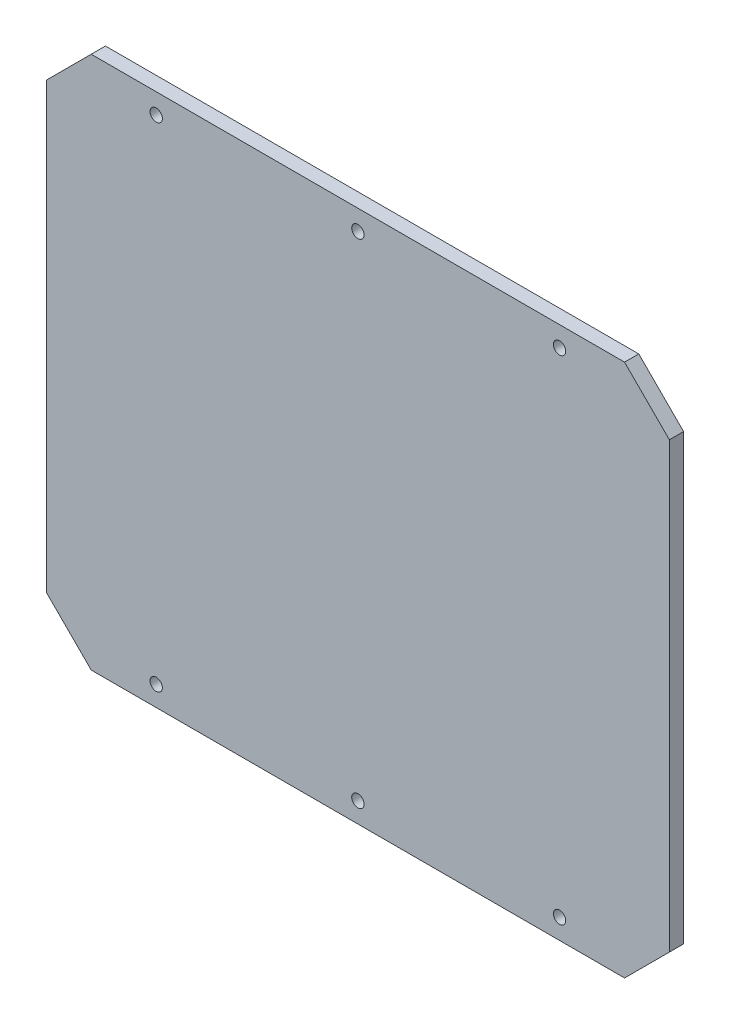
ISO-10303-21;
HEADER;
FILE_DESCRIPTION(('STEP AP214'),'2;1');
FILE_NAME('part.step','',(''),(''),'','','');
FILE_SCHEMA(('AUTOMOTIVE_DESIGN { 1 0 10303 214 1 1 1 1 }'));
ENDSEC;
DATA;
#1=APPLICATION_CONTEXT('core data for automotive mechanical design processes');
#2=APPLICATION_PROTOCOL_DEFINITION('international standard','automotive_design',2000,#1);
#3=PRODUCT_CONTEXT('',#1,'mechanical');
#4=PRODUCT('Part','Part','',(#3));
#5=PRODUCT_RELATED_PRODUCT_CATEGORY('part','',(#4));
#6=PRODUCT_DEFINITION_FORMATION('','',#4);
#7=PRODUCT_DEFINITION_CONTEXT('part definition',#1,'design');
#8=PRODUCT_DEFINITION('design','',#6,#7);
#9=PRODUCT_DEFINITION_SHAPE('','',#8);
#10=(LENGTH_UNIT() NAMED_UNIT(*) SI_UNIT(.MILLI.,.METRE.));
#11=(NAMED_UNIT(*) PLANE_ANGLE_UNIT() SI_UNIT($,.RADIAN.));
#12=(NAMED_UNIT(*) SI_UNIT($,.STERADIAN.) SOLID_ANGLE_UNIT());
#13=UNCERTAINTY_MEASURE_WITH_UNIT(LENGTH_MEASURE(1.E-05),#10,'distance_accuracy_value','');
#14=(GEOMETRIC_REPRESENTATION_CONTEXT(3) GLOBAL_UNCERTAINTY_ASSIGNED_CONTEXT((#13)) GLOBAL_UNIT_ASSIGNED_CONTEXT((#10,
#11,#12)) REPRESENTATION_CONTEXT('',''));
#15=CARTESIAN_POINT('',(0.,0.,0.));
#16=DIRECTION('',(0.,0.,1.));
#17=DIRECTION('',(1.,0.,0.));
#18=AXIS2_PLACEMENT_3D('',#15,#16,#17);
#19=CARTESIAN_POINT('',(-139.,-119.,6.35));
#20=DIRECTION('',(1.,0.,0.));
#21=DIRECTION('',(0.,0.,-1.));
#22=AXIS2_PLACEMENT_3D('',#19,#20,#21);
#23=PLANE('',#22);
#24=DIRECTION('',(0.,-1.,0.));
#25=VECTOR('',#24,1.);
#26=CARTESIAN_POINT('',(-139.,-119.,6.35));
#27=LINE('',#26,#25);
#28=CARTESIAN_POINT('',(-139.,98.9999999999999,6.35));
#29=VERTEX_POINT('',#28);
#30=CARTESIAN_POINT('',(-139.,-98.9999999999999,6.35));
#31=VERTEX_POINT('',#30);
#32=EDGE_CURVE('E130',#29,#31,#27,.T.);
#33=ORIENTED_EDGE('',*,*,#32,.F.);
#34=DIRECTION('',(0.,0.,-1.));
#35=VECTOR('',#34,1.);
#36=CARTESIAN_POINT('',(-139.,99.,6.35));
#37=LINE('',#36,#35);
#38=CARTESIAN_POINT('',(-139.,98.9999999999999,0.));
#39=VERTEX_POINT('',#38);
#40=EDGE_CURVE('E11',#29,#39,#37,.T.);
#41=ORIENTED_EDGE('',*,*,#40,.T.);
#42=DIRECTION('',(0.,-1.,0.));
#43=VECTOR('',#42,1.);
#44=CARTESIAN_POINT('',(-139.,-119.,0.));
#45=LINE('',#44,#43);
#46=CARTESIAN_POINT('',(-139.,-98.9999999999999,0.));
#47=VERTEX_POINT('',#46);
#48=EDGE_CURVE('E132',#39,#47,#45,.T.);
#49=ORIENTED_EDGE('',*,*,#48,.T.);
#50=DIRECTION('',(0.,0.,1.));
#51=VECTOR('',#50,1.);
#52=CARTESIAN_POINT('',(-139.,-98.9999999999999,6.35));
#53=LINE('',#52,#51);
#54=EDGE_CURVE('E42',#47,#31,#53,.T.);
#55=ORIENTED_EDGE('',*,*,#54,.T.);
#56=EDGE_LOOP('',(#33,#41,#49,#55));
#57=FACE_BOUND('',#56,.T.);
#58=ADVANCED_FACE('F33',(#57),#23,.F.);
#59=CARTESIAN_POINT('',(139.,-119.,6.35));
#60=DIRECTION('',(0.,1.,0.));
#61=DIRECTION('',(-1.,0.,0.));
#62=AXIS2_PLACEMENT_3D('',#59,#60,#61);
#63=PLANE('',#62);
#64=DIRECTION('',(1.,0.,0.));
#65=VECTOR('',#64,1.);
#66=CARTESIAN_POINT('',(139.,-119.,0.));
#67=LINE('',#66,#65);
#68=CARTESIAN_POINT('',(-119.,-119.,0.));
#69=VERTEX_POINT('',#68);
#70=CARTESIAN_POINT('',(119.,-119.,0.));
#71=VERTEX_POINT('',#70);
#72=EDGE_CURVE('E128',#69,#71,#67,.T.);
#73=ORIENTED_EDGE('',*,*,#72,.T.);
#74=DIRECTION('',(0.,0.,1.));
#75=VECTOR('',#74,1.);
#76=CARTESIAN_POINT('',(119.,-119.,6.35));
#77=LINE('',#76,#75);
#78=CARTESIAN_POINT('',(119.,-119.,6.35));
#79=VERTEX_POINT('',#78);
#80=EDGE_CURVE('E107',#71,#79,#77,.T.);
#81=ORIENTED_EDGE('',*,*,#80,.T.);
#82=DIRECTION('',(1.,0.,0.));
#83=VECTOR('',#82,1.);
#84=CARTESIAN_POINT('',(139.,-119.,6.35));
#85=LINE('',#84,#83);
#86=CARTESIAN_POINT('',(-119.,-119.,6.35));
#87=VERTEX_POINT('',#86);
#88=EDGE_CURVE('E195',#87,#79,#85,.T.);
#89=ORIENTED_EDGE('',*,*,#88,.F.);
#90=DIRECTION('',(0.,0.,-1.));
#91=VECTOR('',#90,1.);
#92=CARTESIAN_POINT('',(-119.,-119.,6.35));
#93=LINE('',#92,#91);
#94=EDGE_CURVE('E112',#87,#69,#93,.T.);
#95=ORIENTED_EDGE('',*,*,#94,.T.);
#96=EDGE_LOOP('',(#73,#81,#89,#95));
#97=FACE_BOUND('',#96,.T.);
#98=ADVANCED_FACE('F211',(#97),#63,.F.);
#99=CARTESIAN_POINT('',(139.,-119.,6.35));
#100=DIRECTION('',(-1.,0.,0.));
#101=DIRECTION('',(0.,0.,1.));
#102=AXIS2_PLACEMENT_3D('',#99,#100,#101);
#103=PLANE('',#102);
#104=DIRECTION('',(0.,1.,0.));
#105=VECTOR('',#104,1.);
#106=CARTESIAN_POINT('',(139.,-119.,6.35));
#107=LINE('',#106,#105);
#108=CARTESIAN_POINT('',(139.,-99.0000000000001,6.35));
#109=VERTEX_POINT('',#108);
#110=CARTESIAN_POINT('',(139.,98.9999999999999,6.35));
#111=VERTEX_POINT('',#110);
#112=EDGE_CURVE('E121',#109,#111,#107,.T.);
#113=ORIENTED_EDGE('',*,*,#112,.F.);
#114=DIRECTION('',(0.,0.,-1.));
#115=VECTOR('',#114,1.);
#116=CARTESIAN_POINT('',(139.,-99.,6.35));
#117=LINE('',#116,#115);
#118=CARTESIAN_POINT('',(139.,-99.,0.));
#119=VERTEX_POINT('',#118);
#120=EDGE_CURVE('E106',#109,#119,#117,.T.);
#121=ORIENTED_EDGE('',*,*,#120,.T.);
#122=DIRECTION('',(0.,1.,0.));
#123=VECTOR('',#122,1.);
#124=CARTESIAN_POINT('',(139.,-119.,0.));
#125=LINE('',#124,#123);
#126=CARTESIAN_POINT('',(139.,98.9999999999999,0.));
#127=VERTEX_POINT('',#126);
#128=EDGE_CURVE('E119',#119,#127,#125,.T.);
#129=ORIENTED_EDGE('',*,*,#128,.T.);
#130=DIRECTION('',(0.,0.,1.));
#131=VECTOR('',#130,1.);
#132=CARTESIAN_POINT('',(139.,98.9999999999999,6.35));
#133=LINE('',#132,#131);
#134=EDGE_CURVE('E123',#127,#111,#133,.T.);
#135=ORIENTED_EDGE('',*,*,#134,.T.);
#136=EDGE_LOOP('',(#113,#121,#129,#135));
#137=FACE_BOUND('',#136,.T.);
#138=ADVANCED_FACE('F118',(#137),#103,.F.);
#139=CARTESIAN_POINT('',(139.,119.,6.35));
#140=DIRECTION('',(0.,-1.,0.));
#141=DIRECTION('',(1.,0.,0.));
#142=AXIS2_PLACEMENT_3D('',#139,#140,#141);
#143=PLANE('',#142);
#144=DIRECTION('',(-1.,0.,0.));
#145=VECTOR('',#144,1.);
#146=CARTESIAN_POINT('',(139.,119.,6.35));
#147=LINE('',#146,#145);
#148=CARTESIAN_POINT('',(119.,119.,6.35));
#149=VERTEX_POINT('',#148);
#150=CARTESIAN_POINT('',(-119.,119.,6.35));
#151=VERTEX_POINT('',#150);
#152=EDGE_CURVE('E136',#149,#151,#147,.T.);
#153=ORIENTED_EDGE('',*,*,#152,.F.);
#154=DIRECTION('',(0.,0.,-1.));
#155=VECTOR('',#154,1.);
#156=CARTESIAN_POINT('',(119.,119.,6.35));
#157=LINE('',#156,#155);
#158=CARTESIAN_POINT('',(119.,119.,0.));
#159=VERTEX_POINT('',#158);
#160=EDGE_CURVE('E153',#149,#159,#157,.T.);
#161=ORIENTED_EDGE('',*,*,#160,.T.);
#162=DIRECTION('',(-1.,0.,0.));
#163=VECTOR('',#162,1.);
#164=CARTESIAN_POINT('',(139.,119.,0.));
#165=LINE('',#164,#163);
#166=CARTESIAN_POINT('',(-119.,119.,0.));
#167=VERTEX_POINT('',#166);
#168=EDGE_CURVE('E127',#159,#167,#165,.T.);
#169=ORIENTED_EDGE('',*,*,#168,.T.);
#170=DIRECTION('',(0.,0.,1.));
#171=VECTOR('',#170,1.);
#172=CARTESIAN_POINT('',(-119.,119.,6.35));
#173=LINE('',#172,#171);
#174=EDGE_CURVE('E50',#167,#151,#173,.T.);
#175=ORIENTED_EDGE('',*,*,#174,.T.);
#176=EDGE_LOOP('',(#153,#161,#169,#175));
#177=FACE_BOUND('',#176,.T.);
#178=ADVANCED_FACE('F218',(#177),#143,.F.);
#179=CARTESIAN_POINT('',(0.,0.,6.35));
#180=DIRECTION('',(0.,0.,1.));
#181=DIRECTION('',(1.,0.,0.));
#182=AXIS2_PLACEMENT_3D('',#179,#180,#181);
#183=PLANE('',#182);
#184=CARTESIAN_POINT('',(-90.,-110.,6.35));
#185=DIRECTION('',(0.,0.,1.));
#186=DIRECTION('',(-1.,0.,0.));
#187=AXIS2_PLACEMENT_3D('',#184,#185,#186);
#188=CIRCLE('',#187,2.75000000000001);
#189=CARTESIAN_POINT('',(-87.25,-110.,6.35000000000001));
#190=VERTEX_POINT('',#189);
#191=EDGE_CURVE('E184',#190,#190,#188,.T.);
#192=ORIENTED_EDGE('',*,*,#191,.F.);
#193=EDGE_LOOP('',(#192));
#194=FACE_BOUND('',#193,.T.);
#195=CARTESIAN_POINT('',(0.,-110.,6.35));
#196=DIRECTION('',(0.,0.,1.));
#197=DIRECTION('',(-1.,0.,0.));
#198=AXIS2_PLACEMENT_3D('',#195,#196,#197);
#199=CIRCLE('',#198,2.75);
#200=CARTESIAN_POINT('',(2.75000000000004,-110.,6.35000000000001));
#201=VERTEX_POINT('',#200);
#202=EDGE_CURVE('E174',#201,#201,#199,.T.);
#203=ORIENTED_EDGE('',*,*,#202,.F.);
#204=EDGE_LOOP('',(#203));
#205=FACE_BOUND('',#204,.T.);
#206=CARTESIAN_POINT('',(90.0000000000001,-110.,6.35));
#207=DIRECTION('',(0.,0.,1.));
#208=DIRECTION('',(1.,0.,0.));
#209=AXIS2_PLACEMENT_3D('',#206,#207,#208);
#210=CIRCLE('',#209,2.75000000000001);
#211=CARTESIAN_POINT('',(92.7500000000001,-110.,6.35000000000001));
#212=VERTEX_POINT('',#211);
#213=EDGE_CURVE('E171',#212,#212,#210,.T.);
#214=ORIENTED_EDGE('',*,*,#213,.F.);
#215=EDGE_LOOP('',(#214));
#216=FACE_BOUND('',#215,.T.);
#217=CARTESIAN_POINT('',(90.,110.,6.35));
#218=DIRECTION('',(0.,0.,1.));
#219=DIRECTION('',(-1.,0.,0.));
#220=AXIS2_PLACEMENT_3D('',#217,#218,#219);
#221=CIRCLE('',#220,2.75000000000001);
#222=CARTESIAN_POINT('',(92.75,110.,6.35000000000001));
#223=VERTEX_POINT('',#222);
#224=EDGE_CURVE('E168',#223,#223,#221,.T.);
#225=ORIENTED_EDGE('',*,*,#224,.F.);
#226=EDGE_LOOP('',(#225));
#227=FACE_BOUND('',#226,.T.);
#228=CARTESIAN_POINT('',(0.,110.,6.35));
#229=DIRECTION('',(0.,0.,1.));
#230=DIRECTION('',(1.,0.,0.));
#231=AXIS2_PLACEMENT_3D('',#228,#229,#230);
#232=CIRCLE('',#231,2.75);
#233=CARTESIAN_POINT('',(2.75000000000001,110.,6.35000000000001));
#234=VERTEX_POINT('',#233);
#235=EDGE_CURVE('E164',#234,#234,#232,.T.);
#236=ORIENTED_EDGE('',*,*,#235,.F.);
#237=EDGE_LOOP('',(#236));
#238=FACE_BOUND('',#237,.T.);
#239=CARTESIAN_POINT('',(-90.,110.,6.35));
#240=DIRECTION('',(0.,0.,1.));
#241=DIRECTION('',(1.,0.,0.));
#242=AXIS2_PLACEMENT_3D('',#239,#240,#241);
#243=CIRCLE('',#242,2.75000000000001);
#244=CARTESIAN_POINT('',(-87.25,110.,6.35000000000001));
#245=VERTEX_POINT('',#244);
#246=EDGE_CURVE('E160',#245,#245,#243,.T.);
#247=ORIENTED_EDGE('',*,*,#246,.F.);
#248=EDGE_LOOP('',(#247));
#249=FACE_BOUND('',#248,.T.);
#250=ORIENTED_EDGE('',*,*,#88,.T.);
#251=DIRECTION('',(-0.707106781186549,-0.707106781186547,0.));
#252=VECTOR('',#251,1.);
#253=CARTESIAN_POINT('',(119.,-119.,6.35));
#254=LINE('',#253,#252);
#255=EDGE_CURVE('E150',#79,#109,#254,.F.);
#256=ORIENTED_EDGE('',*,*,#255,.T.);
#257=ORIENTED_EDGE('',*,*,#112,.T.);
#258=DIRECTION('',(0.707106781186545,-0.70710678118655,0.));
#259=VECTOR('',#258,1.);
#260=CARTESIAN_POINT('',(119.000000000001,119.,6.35));
#261=LINE('',#260,#259);
#262=EDGE_CURVE('E57',#111,#149,#261,.F.);
#263=ORIENTED_EDGE('',*,*,#262,.T.);
#264=ORIENTED_EDGE('',*,*,#152,.T.);
#265=DIRECTION('',(0.707106781186548,0.707106781186547,0.));
#266=VECTOR('',#265,1.);
#267=CARTESIAN_POINT('',(-119.,119.,6.35));
#268=LINE('',#267,#266);
#269=EDGE_CURVE('E147',#151,#29,#268,.F.);
#270=ORIENTED_EDGE('',*,*,#269,.T.);
#271=ORIENTED_EDGE('',*,*,#32,.T.);
#272=DIRECTION('',(-0.707106781186546,0.70710678118655,0.));
#273=VECTOR('',#272,1.);
#274=CARTESIAN_POINT('',(-119.,-119.,6.35));
#275=LINE('',#274,#273);
#276=EDGE_CURVE('E145',#31,#87,#275,.F.);
#277=ORIENTED_EDGE('',*,*,#276,.T.);
#278=EDGE_LOOP('',(#250,#256,#257,#263,#264,#270,#271,#277));
#279=FACE_BOUND('',#278,.T.);
#280=ADVANCED_FACE('F209',(#194,#205,#216,#227,#238,#249,#279),#183,.T.);
#281=CARTESIAN_POINT('',(0.,0.,0.));
#282=DIRECTION('',(0.,0.,1.));
#283=DIRECTION('',(1.,0.,0.));
#284=AXIS2_PLACEMENT_3D('',#281,#282,#283);
#285=PLANE('',#284);
#286=CARTESIAN_POINT('',(-90.,-110.,0.));
#287=DIRECTION('',(0.,0.,1.));
#288=DIRECTION('',(1.,0.,0.));
#289=AXIS2_PLACEMENT_3D('',#286,#287,#288);
#290=CIRCLE('',#289,2.75000000000001);
#291=CARTESIAN_POINT('',(-87.25,-110.,0.));
#292=VERTEX_POINT('',#291);
#293=EDGE_CURVE('E37',#292,#292,#290,.T.);
#294=ORIENTED_EDGE('',*,*,#293,.T.);
#295=EDGE_LOOP('',(#294));
#296=FACE_BOUND('',#295,.T.);
#297=CARTESIAN_POINT('',(0.,-110.,0.));
#298=DIRECTION('',(0.,0.,1.));
#299=DIRECTION('',(1.,0.,0.));
#300=AXIS2_PLACEMENT_3D('',#297,#298,#299);
#301=CIRCLE('',#300,2.75);
#302=CARTESIAN_POINT('',(2.75000000000004,-110.,0.));
#303=VERTEX_POINT('',#302);
#304=EDGE_CURVE('E172',#303,#303,#301,.T.);
#305=ORIENTED_EDGE('',*,*,#304,.T.);
#306=EDGE_LOOP('',(#305));
#307=FACE_BOUND('',#306,.T.);
#308=CARTESIAN_POINT('',(90.0000000000001,-110.,0.));
#309=DIRECTION('',(0.,0.,1.));
#310=DIRECTION('',(1.,0.,0.));
#311=AXIS2_PLACEMENT_3D('',#308,#309,#310);
#312=CIRCLE('',#311,2.75000000000001);
#313=CARTESIAN_POINT('',(92.7500000000001,-110.,0.));
#314=VERTEX_POINT('',#313);
#315=EDGE_CURVE('E169',#314,#314,#312,.T.);
#316=ORIENTED_EDGE('',*,*,#315,.T.);
#317=EDGE_LOOP('',(#316));
#318=FACE_BOUND('',#317,.T.);
#319=CARTESIAN_POINT('',(90.,110.,0.));
#320=DIRECTION('',(0.,0.,1.));
#321=DIRECTION('',(1.,0.,0.));
#322=AXIS2_PLACEMENT_3D('',#319,#320,#321);
#323=CIRCLE('',#322,2.75000000000001);
#324=CARTESIAN_POINT('',(92.75,110.,0.));
#325=VERTEX_POINT('',#324);
#326=EDGE_CURVE('E165',#325,#325,#323,.T.);
#327=ORIENTED_EDGE('',*,*,#326,.T.);
#328=EDGE_LOOP('',(#327));
#329=FACE_BOUND('',#328,.T.);
#330=CARTESIAN_POINT('',(0.,110.,0.));
#331=DIRECTION('',(0.,0.,1.));
#332=DIRECTION('',(1.,0.,0.));
#333=AXIS2_PLACEMENT_3D('',#330,#331,#332);
#334=CIRCLE('',#333,2.75);
#335=CARTESIAN_POINT('',(2.75000000000001,110.,0.));
#336=VERTEX_POINT('',#335);
#337=EDGE_CURVE('E161',#336,#336,#334,.T.);
#338=ORIENTED_EDGE('',*,*,#337,.T.);
#339=EDGE_LOOP('',(#338));
#340=FACE_BOUND('',#339,.T.);
#341=CARTESIAN_POINT('',(-90.,110.,0.));
#342=DIRECTION('',(0.,0.,1.));
#343=DIRECTION('',(1.,0.,0.));
#344=AXIS2_PLACEMENT_3D('',#341,#342,#343);
#345=CIRCLE('',#344,2.75000000000001);
#346=CARTESIAN_POINT('',(-87.25,110.,0.));
#347=VERTEX_POINT('',#346);
#348=EDGE_CURVE('E157',#347,#347,#345,.T.);
#349=ORIENTED_EDGE('',*,*,#348,.T.);
#350=EDGE_LOOP('',(#349));
#351=FACE_BOUND('',#350,.T.);
#352=ORIENTED_EDGE('',*,*,#128,.F.);
#353=DIRECTION('',(0.707106781186549,0.707106781186547,0.));
#354=VECTOR('',#353,1.);
#355=CARTESIAN_POINT('',(139.,-99.,0.));
#356=LINE('',#355,#354);
#357=EDGE_CURVE('E102',#119,#71,#356,.F.);
#358=ORIENTED_EDGE('',*,*,#357,.T.);
#359=ORIENTED_EDGE('',*,*,#72,.F.);
#360=DIRECTION('',(0.707106781186546,-0.70710678118655,0.));
#361=VECTOR('',#360,1.);
#362=CARTESIAN_POINT('',(-119.,-119.,0.));
#363=LINE('',#362,#361);
#364=EDGE_CURVE('E122',#69,#47,#363,.F.);
#365=ORIENTED_EDGE('',*,*,#364,.T.);
#366=ORIENTED_EDGE('',*,*,#48,.F.);
#367=DIRECTION('',(-0.707106781186548,-0.707106781186547,0.));
#368=VECTOR('',#367,1.);
#369=CARTESIAN_POINT('',(-139.,99.,0.));
#370=LINE('',#369,#368);
#371=EDGE_CURVE('E139',#39,#167,#370,.F.);
#372=ORIENTED_EDGE('',*,*,#371,.T.);
#373=ORIENTED_EDGE('',*,*,#168,.F.);
#374=DIRECTION('',(-0.707106781186545,0.70710678118655,0.));
#375=VECTOR('',#374,1.);
#376=CARTESIAN_POINT('',(119.,119.,0.));
#377=LINE('',#376,#375);
#378=EDGE_CURVE('E113',#159,#127,#377,.F.);
#379=ORIENTED_EDGE('',*,*,#378,.T.);
#380=EDGE_LOOP('',(#352,#358,#359,#365,#366,#372,#373,#379));
#381=FACE_BOUND('',#380,.T.);
#382=ADVANCED_FACE('F125',(#296,#307,#318,#329,#340,#351,#381),#285,.F.);
#383=CARTESIAN_POINT('',(139.,-99.,6.35));
#384=DIRECTION('',(-0.707106781186546,0.707106781186548,0.));
#385=DIRECTION('',(0.,0.,-1.));
#386=AXIS2_PLACEMENT_3D('',#383,#384,#385);
#387=PLANE('',#386);
#388=ORIENTED_EDGE('',*,*,#255,.F.);
#389=ORIENTED_EDGE('',*,*,#80,.F.);
#390=ORIENTED_EDGE('',*,*,#357,.F.);
#391=ORIENTED_EDGE('',*,*,#120,.F.);
#392=EDGE_LOOP('',(#388,#389,#390,#391));
#393=FACE_BOUND('',#392,.T.);
#394=ADVANCED_FACE('F105',(#393),#387,.F.);
#395=CARTESIAN_POINT('',(119.,119.,6.35));
#396=DIRECTION('',(-0.707106781186551,-0.707106781186545,0.));
#397=DIRECTION('',(0.,0.,-1.));
#398=AXIS2_PLACEMENT_3D('',#395,#396,#397);
#399=PLANE('',#398);
#400=ORIENTED_EDGE('',*,*,#262,.F.);
#401=ORIENTED_EDGE('',*,*,#134,.F.);
#402=ORIENTED_EDGE('',*,*,#378,.F.);
#403=ORIENTED_EDGE('',*,*,#160,.F.);
#404=EDGE_LOOP('',(#400,#401,#402,#403));
#405=FACE_BOUND('',#404,.T.);
#406=ADVANCED_FACE('F225',(#405),#399,.F.);
#407=CARTESIAN_POINT('',(-139.,99.,6.35));
#408=DIRECTION('',(0.707106781186547,-0.707106781186548,0.));
#409=DIRECTION('',(0.,0.,-1.));
#410=AXIS2_PLACEMENT_3D('',#407,#408,#409);
#411=PLANE('',#410);
#412=ORIENTED_EDGE('',*,*,#269,.F.);
#413=ORIENTED_EDGE('',*,*,#174,.F.);
#414=ORIENTED_EDGE('',*,*,#371,.F.);
#415=ORIENTED_EDGE('',*,*,#40,.F.);
#416=EDGE_LOOP('',(#412,#413,#414,#415));
#417=FACE_BOUND('',#416,.T.);
#418=ADVANCED_FACE('F227',(#417),#411,.F.);
#419=CARTESIAN_POINT('',(-119.,-119.,6.35));
#420=DIRECTION('',(0.707106781186549,0.707106781186545,0.));
#421=DIRECTION('',(0.,0.,-1.));
#422=AXIS2_PLACEMENT_3D('',#419,#420,#421);
#423=PLANE('',#422);
#424=ORIENTED_EDGE('',*,*,#276,.F.);
#425=ORIENTED_EDGE('',*,*,#54,.F.);
#426=ORIENTED_EDGE('',*,*,#364,.F.);
#427=ORIENTED_EDGE('',*,*,#94,.F.);
#428=EDGE_LOOP('',(#424,#425,#426,#427));
#429=FACE_BOUND('',#428,.T.);
#430=ADVANCED_FACE('F35',(#429),#423,.F.);
#431=CARTESIAN_POINT('',(-90.,110.,-69.85));
#432=DIRECTION('',(0.,0.,1.));
#433=DIRECTION('',(1.,0.,0.));
#434=AXIS2_PLACEMENT_3D('',#431,#432,#433);
#435=CYLINDRICAL_SURFACE('',#434,2.75000000000001);
#436=CARTESIAN_POINT('',(-87.25,110.,6.35000000000001));
#437=CARTESIAN_POINT('',(-87.25,110.,6.28385416666668));
#438=CARTESIAN_POINT('',(-87.25,110.,6.21770833333334));
#439=CARTESIAN_POINT('',(-87.25,110.,6.08541666666668));
#440=CARTESIAN_POINT('',(-87.25,110.,6.01927083333334));
#441=CARTESIAN_POINT('',(-87.25,110.,5.88697916666667));
#442=CARTESIAN_POINT('',(-87.25,110.,5.82083333333334));
#443=CARTESIAN_POINT('',(-87.25,110.,5.68854166666667));
#444=CARTESIAN_POINT('',(-87.25,110.,5.62239583333333));
#445=CARTESIAN_POINT('',(-87.25,110.,5.49010416666667));
#446=CARTESIAN_POINT('',(-87.25,110.,5.42395833333333));
#447=CARTESIAN_POINT('',(-87.25,110.,5.29166666666667));
#448=CARTESIAN_POINT('',(-87.25,110.,5.22552083333334));
#449=CARTESIAN_POINT('',(-87.25,110.,5.09322916666667));
#450=CARTESIAN_POINT('',(-87.25,110.,5.02708333333333));
#451=CARTESIAN_POINT('',(-87.25,110.,4.89479166666667));
#452=CARTESIAN_POINT('',(-87.25,110.,4.82864583333333));
#453=CARTESIAN_POINT('',(-87.25,110.,4.69635416666667));
#454=CARTESIAN_POINT('',(-87.25,110.,4.63020833333334));
#455=CARTESIAN_POINT('',(-87.25,110.,4.49791666666667));
#456=CARTESIAN_POINT('',(-87.25,110.,4.43177083333333));
#457=CARTESIAN_POINT('',(-87.25,110.,4.29947916666667));
#458=CARTESIAN_POINT('',(-87.25,110.,4.23333333333333));
#459=CARTESIAN_POINT('',(-87.25,110.,4.10104166666667));
#460=CARTESIAN_POINT('',(-87.25,110.,4.03489583333334));
#461=CARTESIAN_POINT('',(-87.25,110.,3.90260416666667));
#462=CARTESIAN_POINT('',(-87.25,110.,3.83645833333333));
#463=CARTESIAN_POINT('',(-87.25,110.,3.70416666666667));
#464=CARTESIAN_POINT('',(-87.25,110.,3.63802083333333));
#465=CARTESIAN_POINT('',(-87.25,110.,3.50572916666667));
#466=CARTESIAN_POINT('',(-87.25,110.,3.43958333333333));
#467=CARTESIAN_POINT('',(-87.25,110.,3.30729166666666));
#468=CARTESIAN_POINT('',(-87.25,110.,3.24114583333333));
#469=CARTESIAN_POINT('',(-87.25,110.,3.10885416666667));
#470=CARTESIAN_POINT('',(-87.25,110.,3.04270833333333));
#471=CARTESIAN_POINT('',(-87.25,110.,2.91041666666667));
#472=CARTESIAN_POINT('',(-87.25,110.,2.84427083333333));
#473=CARTESIAN_POINT('',(-87.25,110.,2.71197916666666));
#474=CARTESIAN_POINT('',(-87.25,110.,2.64583333333333));
#475=CARTESIAN_POINT('',(-87.25,110.,2.51354166666666));
#476=CARTESIAN_POINT('',(-87.25,110.,2.44739583333332));
#477=CARTESIAN_POINT('',(-87.25,110.,2.31510416666666));
#478=CARTESIAN_POINT('',(-87.25,110.,2.24895833333332));
#479=CARTESIAN_POINT('',(-87.25,110.,2.11666666666666));
#480=CARTESIAN_POINT('',(-87.25,110.,2.05052083333333));
#481=CARTESIAN_POINT('',(-87.25,110.,1.91822916666666));
#482=CARTESIAN_POINT('',(-87.25,110.,1.85208333333332));
#483=CARTESIAN_POINT('',(-87.25,110.,1.71979166666666));
#484=CARTESIAN_POINT('',(-87.25,110.,1.65364583333332));
#485=CARTESIAN_POINT('',(-87.25,110.,1.52135416666666));
#486=CARTESIAN_POINT('',(-87.25,110.,1.45520833333333));
#487=CARTESIAN_POINT('',(-87.25,110.,1.32291666666666));
#488=CARTESIAN_POINT('',(-87.25,110.,1.25677083333332));
#489=CARTESIAN_POINT('',(-87.25,110.,1.12447916666665));
#490=CARTESIAN_POINT('',(-87.25,110.,1.05833333333332));
#491=CARTESIAN_POINT('',(-87.25,110.,0.92604166666666));
#492=CARTESIAN_POINT('',(-87.25,110.,0.859895833333328));
#493=CARTESIAN_POINT('',(-87.25,110.,0.727604166666659));
#494=CARTESIAN_POINT('',(-87.25,110.,0.661458333333323));
#495=CARTESIAN_POINT('',(-87.25,110.,0.529166666666655));
#496=CARTESIAN_POINT('',(-87.25,110.,0.463020833333323));
#497=CARTESIAN_POINT('',(-87.25,110.,0.330729166666655));
#498=CARTESIAN_POINT('',(-87.25,110.,0.264583333333318));
#499=CARTESIAN_POINT('',(-87.25,110.,0.13229166666665));
#500=CARTESIAN_POINT('',(-87.25,110.,0.066145833333318));
#501=CARTESIAN_POINT('',(-87.25,110.,0.));
#502=B_SPLINE_CURVE_WITH_KNOTS('',3,(#436,#437,#438,#439,#440,#441,#442,#443,#444,#445,#446,
#447,#448,#449,#450,#451,#452,#453,#454,#455,#456,#457,#458,#459,#460,#461,#462,#463,#464,#465,
#466,#467,#468,#469,#470,#471,#472,#473,#474,#475,#476,#477,#478,#479,#480,#481,#482,#483,#484,
#485,#486,#487,#488,#489,#490,#491,#492,#493,#494,#495,#496,#497,#498,#499,#500,#501),
.UNSPECIFIED.,.F.,.F.,(4,2,2,2,2,2,2,2,2,2,2,2,2,2,2,2,2,2,2,2,2,2,2,2,2,2,2,2,2,2,2,2,4),(0.,
0.198437499999995,0.396875000000005,0.5953125,0.79375000000001,0.992187500000005,1.190625,
1.38906250000001,1.58750000000001,1.7859375,1.98437500000001,2.18281250000001,2.38125,
2.57968750000001,2.77812500000001,2.97656250000002,3.17500000000001,3.37343750000001,
3.57187500000002,3.77031250000001,3.96875000000002,4.16718750000002,4.36562500000001,
4.56406250000002,4.76250000000002,4.96093750000001,5.15937500000002,5.35781250000002,
5.55625000000001,5.75468750000002,5.95312500000002,6.15156250000003,6.35000000000002),.UNSPECIFIED.);
#503=EDGE_CURVE('BSEAM234',#245,#347,#502,.T.);
#504=ORIENTED_EDGE('',*,*,#246,.T.);
#505=ORIENTED_EDGE('',*,*,#348,.F.);
#506=ORIENTED_EDGE('',*,*,#503,.T.);
#507=ORIENTED_EDGE('',*,*,#503,.F.);
#508=EDGE_LOOP('',(#504,#506,#505,#507));
#509=FACE_BOUND('',#508,.T.);
#510=ADVANCED_FACE('F234',(#509),#435,.F.);
#511=CARTESIAN_POINT('',(0.,110.,-69.85));
#512=DIRECTION('',(0.,0.,1.));
#513=DIRECTION('',(1.,0.,0.));
#514=AXIS2_PLACEMENT_3D('',#511,#512,#513);
#515=CYLINDRICAL_SURFACE('',#514,2.75);
#516=CARTESIAN_POINT('',(2.75000000000001,110.,6.35000000000001));
#517=CARTESIAN_POINT('',(2.75000000000001,110.,6.28385416666668));
#518=CARTESIAN_POINT('',(2.75000000000001,110.,6.21770833333334));
#519=CARTESIAN_POINT('',(2.75000000000001,110.,6.08541666666668));
#520=CARTESIAN_POINT('',(2.75000000000001,110.,6.01927083333334));
#521=CARTESIAN_POINT('',(2.75000000000001,110.,5.88697916666667));
#522=CARTESIAN_POINT('',(2.75000000000001,110.,5.82083333333334));
#523=CARTESIAN_POINT('',(2.75000000000001,110.,5.68854166666667));
#524=CARTESIAN_POINT('',(2.75000000000001,110.,5.62239583333333));
#525=CARTESIAN_POINT('',(2.75000000000001,110.,5.49010416666667));
#526=CARTESIAN_POINT('',(2.75000000000001,110.,5.42395833333333));
#527=CARTESIAN_POINT('',(2.75000000000001,110.,5.29166666666667));
#528=CARTESIAN_POINT('',(2.75000000000001,110.,5.22552083333334));
#529=CARTESIAN_POINT('',(2.75000000000001,110.,5.09322916666667));
#530=CARTESIAN_POINT('',(2.75000000000001,110.,5.02708333333333));
#531=CARTESIAN_POINT('',(2.75000000000001,110.,4.89479166666667));
#532=CARTESIAN_POINT('',(2.75000000000001,110.,4.82864583333333));
#533=CARTESIAN_POINT('',(2.75000000000001,110.,4.69635416666667));
#534=CARTESIAN_POINT('',(2.75000000000001,110.,4.63020833333334));
#535=CARTESIAN_POINT('',(2.75000000000001,110.,4.49791666666667));
#536=CARTESIAN_POINT('',(2.75000000000001,110.,4.43177083333333));
#537=CARTESIAN_POINT('',(2.75000000000001,110.,4.29947916666667));
#538=CARTESIAN_POINT('',(2.75000000000001,110.,4.23333333333333));
#539=CARTESIAN_POINT('',(2.75000000000001,110.,4.10104166666667));
#540=CARTESIAN_POINT('',(2.75000000000001,110.,4.03489583333334));
#541=CARTESIAN_POINT('',(2.75000000000001,110.,3.90260416666667));
#542=CARTESIAN_POINT('',(2.75000000000001,110.,3.83645833333333));
#543=CARTESIAN_POINT('',(2.75000000000001,110.,3.70416666666667));
#544=CARTESIAN_POINT('',(2.75000000000001,110.,3.63802083333333));
#545=CARTESIAN_POINT('',(2.75000000000001,110.,3.50572916666667));
#546=CARTESIAN_POINT('',(2.75000000000001,110.,3.43958333333333));
#547=CARTESIAN_POINT('',(2.75000000000001,110.,3.30729166666666));
#548=CARTESIAN_POINT('',(2.75000000000001,110.,3.24114583333333));
#549=CARTESIAN_POINT('',(2.75000000000001,110.,3.10885416666667));
#550=CARTESIAN_POINT('',(2.75000000000001,110.,3.04270833333333));
#551=CARTESIAN_POINT('',(2.75000000000001,110.,2.91041666666667));
#552=CARTESIAN_POINT('',(2.75000000000001,110.,2.84427083333333));
#553=CARTESIAN_POINT('',(2.75000000000001,110.,2.71197916666666));
#554=CARTESIAN_POINT('',(2.75000000000001,110.,2.64583333333333));
#555=CARTESIAN_POINT('',(2.75000000000001,110.,2.51354166666666));
#556=CARTESIAN_POINT('',(2.75000000000001,110.,2.44739583333332));
#557=CARTESIAN_POINT('',(2.75000000000001,110.,2.31510416666666));
#558=CARTESIAN_POINT('',(2.75000000000001,110.,2.24895833333332));
#559=CARTESIAN_POINT('',(2.75000000000001,110.,2.11666666666666));
#560=CARTESIAN_POINT('',(2.75000000000001,110.,2.05052083333333));
#561=CARTESIAN_POINT('',(2.75000000000001,110.,1.91822916666666));
#562=CARTESIAN_POINT('',(2.75000000000001,110.,1.85208333333332));
#563=CARTESIAN_POINT('',(2.75000000000001,110.,1.71979166666666));
#564=CARTESIAN_POINT('',(2.75000000000001,110.,1.65364583333332));
#565=CARTESIAN_POINT('',(2.75000000000001,110.,1.52135416666666));
#566=CARTESIAN_POINT('',(2.75000000000001,110.,1.45520833333333));
#567=CARTESIAN_POINT('',(2.75000000000001,110.,1.32291666666666));
#568=CARTESIAN_POINT('',(2.75000000000001,110.,1.25677083333332));
#569=CARTESIAN_POINT('',(2.75000000000001,110.,1.12447916666665));
#570=CARTESIAN_POINT('',(2.75000000000001,110.,1.05833333333332));
#571=CARTESIAN_POINT('',(2.75000000000001,110.,0.92604166666666));
#572=CARTESIAN_POINT('',(2.75000000000001,110.,0.859895833333328));
#573=CARTESIAN_POINT('',(2.75000000000001,110.,0.727604166666659));
#574=CARTESIAN_POINT('',(2.75000000000001,110.,0.661458333333323));
#575=CARTESIAN_POINT('',(2.75000000000001,110.,0.529166666666655));
#576=CARTESIAN_POINT('',(2.75000000000001,110.,0.463020833333323));
#577=CARTESIAN_POINT('',(2.75000000000001,110.,0.330729166666655));
#578=CARTESIAN_POINT('',(2.75000000000001,110.,0.264583333333318));
#579=CARTESIAN_POINT('',(2.75000000000001,110.,0.13229166666665));
#580=CARTESIAN_POINT('',(2.75000000000001,110.,0.066145833333318));
#581=CARTESIAN_POINT('',(2.75000000000001,110.,0.));
#582=B_SPLINE_CURVE_WITH_KNOTS('',3,(#516,#517,#518,#519,#520,#521,#522,#523,#524,#525,#526,
#527,#528,#529,#530,#531,#532,#533,#534,#535,#536,#537,#538,#539,#540,#541,#542,#543,#544,#545,
#546,#547,#548,#549,#550,#551,#552,#553,#554,#555,#556,#557,#558,#559,#560,#561,#562,#563,#564,
#565,#566,#567,#568,#569,#570,#571,#572,#573,#574,#575,#576,#577,#578,#579,#580,#581),
.UNSPECIFIED.,.F.,.F.,(4,2,2,2,2,2,2,2,2,2,2,2,2,2,2,2,2,2,2,2,2,2,2,2,2,2,2,2,2,2,2,2,4),(0.,
0.198437499999995,0.396875000000005,0.5953125,0.79375000000001,0.992187500000005,1.190625,
1.38906250000001,1.58750000000001,1.7859375,1.98437500000001,2.18281250000001,2.38125,
2.57968750000001,2.77812500000001,2.97656250000002,3.17500000000001,3.37343750000001,
3.57187500000002,3.77031250000001,3.96875000000002,4.16718750000002,4.36562500000001,
4.56406250000002,4.76250000000002,4.96093750000001,5.15937500000002,5.35781250000002,
5.55625000000001,5.75468750000002,5.95312500000002,6.15156250000003,6.35000000000002),.UNSPECIFIED.);
#583=EDGE_CURVE('BSEAM249',#234,#336,#582,.T.);
#584=ORIENTED_EDGE('',*,*,#235,.T.);
#585=ORIENTED_EDGE('',*,*,#337,.F.);
#586=ORIENTED_EDGE('',*,*,#583,.T.);
#587=ORIENTED_EDGE('',*,*,#583,.F.);
#588=EDGE_LOOP('',(#584,#586,#585,#587));
#589=FACE_BOUND('',#588,.T.);
#590=ADVANCED_FACE('F249',(#589),#515,.F.);
#591=CARTESIAN_POINT('',(90.,110.,-69.85));
#592=DIRECTION('',(0.,0.,1.));
#593=DIRECTION('',(1.,0.,0.));
#594=AXIS2_PLACEMENT_3D('',#591,#592,#593);
#595=CYLINDRICAL_SURFACE('',#594,2.75000000000001);
#596=CARTESIAN_POINT('',(92.75,110.,6.35000000000001));
#597=CARTESIAN_POINT('',(92.75,110.,6.28385416666668));
#598=CARTESIAN_POINT('',(92.75,110.,6.21770833333334));
#599=CARTESIAN_POINT('',(92.75,110.,6.08541666666668));
#600=CARTESIAN_POINT('',(92.75,110.,6.01927083333334));
#601=CARTESIAN_POINT('',(92.75,110.,5.88697916666667));
#602=CARTESIAN_POINT('',(92.75,110.,5.82083333333334));
#603=CARTESIAN_POINT('',(92.75,110.,5.68854166666667));
#604=CARTESIAN_POINT('',(92.75,110.,5.62239583333333));
#605=CARTESIAN_POINT('',(92.75,110.,5.49010416666667));
#606=CARTESIAN_POINT('',(92.75,110.,5.42395833333333));
#607=CARTESIAN_POINT('',(92.75,110.,5.29166666666667));
#608=CARTESIAN_POINT('',(92.75,110.,5.22552083333334));
#609=CARTESIAN_POINT('',(92.75,110.,5.09322916666667));
#610=CARTESIAN_POINT('',(92.75,110.,5.02708333333333));
#611=CARTESIAN_POINT('',(92.75,110.,4.89479166666667));
#612=CARTESIAN_POINT('',(92.75,110.,4.82864583333333));
#613=CARTESIAN_POINT('',(92.75,110.,4.69635416666667));
#614=CARTESIAN_POINT('',(92.75,110.,4.63020833333334));
#615=CARTESIAN_POINT('',(92.75,110.,4.49791666666667));
#616=CARTESIAN_POINT('',(92.75,110.,4.43177083333333));
#617=CARTESIAN_POINT('',(92.75,110.,4.29947916666667));
#618=CARTESIAN_POINT('',(92.75,110.,4.23333333333333));
#619=CARTESIAN_POINT('',(92.75,110.,4.10104166666667));
#620=CARTESIAN_POINT('',(92.75,110.,4.03489583333334));
#621=CARTESIAN_POINT('',(92.75,110.,3.90260416666667));
#622=CARTESIAN_POINT('',(92.75,110.,3.83645833333333));
#623=CARTESIAN_POINT('',(92.75,110.,3.70416666666667));
#624=CARTESIAN_POINT('',(92.75,110.,3.63802083333333));
#625=CARTESIAN_POINT('',(92.75,110.,3.50572916666667));
#626=CARTESIAN_POINT('',(92.75,110.,3.43958333333333));
#627=CARTESIAN_POINT('',(92.75,110.,3.30729166666666));
#628=CARTESIAN_POINT('',(92.75,110.,3.24114583333333));
#629=CARTESIAN_POINT('',(92.75,110.,3.10885416666667));
#630=CARTESIAN_POINT('',(92.75,110.,3.04270833333333));
#631=CARTESIAN_POINT('',(92.75,110.,2.91041666666667));
#632=CARTESIAN_POINT('',(92.75,110.,2.84427083333333));
#633=CARTESIAN_POINT('',(92.75,110.,2.71197916666666));
#634=CARTESIAN_POINT('',(92.75,110.,2.64583333333333));
#635=CARTESIAN_POINT('',(92.75,110.,2.51354166666666));
#636=CARTESIAN_POINT('',(92.75,110.,2.44739583333332));
#637=CARTESIAN_POINT('',(92.75,110.,2.31510416666666));
#638=CARTESIAN_POINT('',(92.75,110.,2.24895833333332));
#639=CARTESIAN_POINT('',(92.75,110.,2.11666666666666));
#640=CARTESIAN_POINT('',(92.75,110.,2.05052083333333));
#641=CARTESIAN_POINT('',(92.75,110.,1.91822916666666));
#642=CARTESIAN_POINT('',(92.75,110.,1.85208333333332));
#643=CARTESIAN_POINT('',(92.75,110.,1.71979166666666));
#644=CARTESIAN_POINT('',(92.75,110.,1.65364583333332));
#645=CARTESIAN_POINT('',(92.75,110.,1.52135416666666));
#646=CARTESIAN_POINT('',(92.75,110.,1.45520833333333));
#647=CARTESIAN_POINT('',(92.75,110.,1.32291666666666));
#648=CARTESIAN_POINT('',(92.75,110.,1.25677083333332));
#649=CARTESIAN_POINT('',(92.75,110.,1.12447916666665));
#650=CARTESIAN_POINT('',(92.75,110.,1.05833333333332));
#651=CARTESIAN_POINT('',(92.75,110.,0.92604166666666));
#652=CARTESIAN_POINT('',(92.75,110.,0.859895833333328));
#653=CARTESIAN_POINT('',(92.75,110.,0.727604166666659));
#654=CARTESIAN_POINT('',(92.75,110.,0.661458333333323));
#655=CARTESIAN_POINT('',(92.75,110.,0.529166666666655));
#656=CARTESIAN_POINT('',(92.75,110.,0.463020833333323));
#657=CARTESIAN_POINT('',(92.75,110.,0.330729166666655));
#658=CARTESIAN_POINT('',(92.75,110.,0.264583333333318));
#659=CARTESIAN_POINT('',(92.75,110.,0.13229166666665));
#660=CARTESIAN_POINT('',(92.75,110.,0.066145833333318));
#661=CARTESIAN_POINT('',(92.75,110.,0.));
#662=B_SPLINE_CURVE_WITH_KNOTS('',3,(#596,#597,#598,#599,#600,#601,#602,#603,#604,#605,#606,
#607,#608,#609,#610,#611,#612,#613,#614,#615,#616,#617,#618,#619,#620,#621,#622,#623,#624,#625,
#626,#627,#628,#629,#630,#631,#632,#633,#634,#635,#636,#637,#638,#639,#640,#641,#642,#643,#644,
#645,#646,#647,#648,#649,#650,#651,#652,#653,#654,#655,#656,#657,#658,#659,#660,#661),
.UNSPECIFIED.,.F.,.F.,(4,2,2,2,2,2,2,2,2,2,2,2,2,2,2,2,2,2,2,2,2,2,2,2,2,2,2,2,2,2,2,2,4),(0.,
0.198437499999995,0.396875000000005,0.5953125,0.79375000000001,0.992187500000005,1.190625,
1.38906250000001,1.58750000000001,1.7859375,1.98437500000001,2.18281250000001,2.38125,
2.57968750000001,2.77812500000001,2.97656250000002,3.17500000000001,3.37343750000001,
3.57187500000002,3.77031250000001,3.96875000000002,4.16718750000002,4.36562500000001,
4.56406250000002,4.76250000000002,4.96093750000001,5.15937500000002,5.35781250000002,
5.55625000000001,5.75468750000002,5.95312500000002,6.15156250000003,6.35000000000002),.UNSPECIFIED.);
#663=EDGE_CURVE('BSEAM253',#223,#325,#662,.T.);
#664=ORIENTED_EDGE('',*,*,#224,.T.);
#665=ORIENTED_EDGE('',*,*,#326,.F.);
#666=ORIENTED_EDGE('',*,*,#663,.T.);
#667=ORIENTED_EDGE('',*,*,#663,.F.);
#668=EDGE_LOOP('',(#664,#666,#665,#667));
#669=FACE_BOUND('',#668,.T.);
#670=ADVANCED_FACE('F253',(#669),#595,.F.);
#671=CARTESIAN_POINT('',(90.0000000000001,-110.,-69.85));
#672=DIRECTION('',(0.,0.,1.));
#673=DIRECTION('',(1.,0.,0.));
#674=AXIS2_PLACEMENT_3D('',#671,#672,#673);
#675=CYLINDRICAL_SURFACE('',#674,2.75000000000001);
#676=CARTESIAN_POINT('',(92.7500000000001,-110.,6.35000000000001));
#677=CARTESIAN_POINT('',(92.7500000000001,-110.,6.28385416666668));
#678=CARTESIAN_POINT('',(92.7500000000001,-110.,6.21770833333334));
#679=CARTESIAN_POINT('',(92.7500000000001,-110.,6.08541666666668));
#680=CARTESIAN_POINT('',(92.7500000000001,-110.,6.01927083333334));
#681=CARTESIAN_POINT('',(92.7500000000001,-110.,5.88697916666667));
#682=CARTESIAN_POINT('',(92.7500000000001,-110.,5.82083333333334));
#683=CARTESIAN_POINT('',(92.7500000000001,-110.,5.68854166666667));
#684=CARTESIAN_POINT('',(92.7500000000001,-110.,5.62239583333333));
#685=CARTESIAN_POINT('',(92.7500000000001,-110.,5.49010416666667));
#686=CARTESIAN_POINT('',(92.7500000000001,-110.,5.42395833333333));
#687=CARTESIAN_POINT('',(92.7500000000001,-110.,5.29166666666667));
#688=CARTESIAN_POINT('',(92.7500000000001,-110.,5.22552083333334));
#689=CARTESIAN_POINT('',(92.7500000000001,-110.,5.09322916666667));
#690=CARTESIAN_POINT('',(92.7500000000001,-110.,5.02708333333333));
#691=CARTESIAN_POINT('',(92.7500000000001,-110.,4.89479166666667));
#692=CARTESIAN_POINT('',(92.7500000000001,-110.,4.82864583333333));
#693=CARTESIAN_POINT('',(92.7500000000001,-110.,4.69635416666667));
#694=CARTESIAN_POINT('',(92.7500000000001,-110.,4.63020833333334));
#695=CARTESIAN_POINT('',(92.7500000000001,-110.,4.49791666666667));
#696=CARTESIAN_POINT('',(92.7500000000001,-110.,4.43177083333333));
#697=CARTESIAN_POINT('',(92.7500000000001,-110.,4.29947916666667));
#698=CARTESIAN_POINT('',(92.7500000000001,-110.,4.23333333333333));
#699=CARTESIAN_POINT('',(92.7500000000001,-110.,4.10104166666667));
#700=CARTESIAN_POINT('',(92.7500000000001,-110.,4.03489583333334));
#701=CARTESIAN_POINT('',(92.7500000000001,-110.,3.90260416666667));
#702=CARTESIAN_POINT('',(92.7500000000001,-110.,3.83645833333333));
#703=CARTESIAN_POINT('',(92.7500000000001,-110.,3.70416666666667));
#704=CARTESIAN_POINT('',(92.7500000000001,-110.,3.63802083333333));
#705=CARTESIAN_POINT('',(92.7500000000001,-110.,3.50572916666667));
#706=CARTESIAN_POINT('',(92.7500000000001,-110.,3.43958333333333));
#707=CARTESIAN_POINT('',(92.7500000000001,-110.,3.30729166666666));
#708=CARTESIAN_POINT('',(92.7500000000001,-110.,3.24114583333333));
#709=CARTESIAN_POINT('',(92.7500000000001,-110.,3.10885416666667));
#710=CARTESIAN_POINT('',(92.7500000000001,-110.,3.04270833333333));
#711=CARTESIAN_POINT('',(92.7500000000001,-110.,2.91041666666667));
#712=CARTESIAN_POINT('',(92.7500000000001,-110.,2.84427083333333));
#713=CARTESIAN_POINT('',(92.7500000000001,-110.,2.71197916666666));
#714=CARTESIAN_POINT('',(92.7500000000001,-110.,2.64583333333333));
#715=CARTESIAN_POINT('',(92.7500000000001,-110.,2.51354166666666));
#716=CARTESIAN_POINT('',(92.7500000000001,-110.,2.44739583333332));
#717=CARTESIAN_POINT('',(92.7500000000001,-110.,2.31510416666666));
#718=CARTESIAN_POINT('',(92.7500000000001,-110.,2.24895833333332));
#719=CARTESIAN_POINT('',(92.7500000000001,-110.,2.11666666666666));
#720=CARTESIAN_POINT('',(92.7500000000001,-110.,2.05052083333333));
#721=CARTESIAN_POINT('',(92.7500000000001,-110.,1.91822916666666));
#722=CARTESIAN_POINT('',(92.7500000000001,-110.,1.85208333333332));
#723=CARTESIAN_POINT('',(92.7500000000001,-110.,1.71979166666666));
#724=CARTESIAN_POINT('',(92.7500000000001,-110.,1.65364583333332));
#725=CARTESIAN_POINT('',(92.7500000000001,-110.,1.52135416666666));
#726=CARTESIAN_POINT('',(92.7500000000001,-110.,1.45520833333333));
#727=CARTESIAN_POINT('',(92.7500000000001,-110.,1.32291666666666));
#728=CARTESIAN_POINT('',(92.7500000000001,-110.,1.25677083333332));
#729=CARTESIAN_POINT('',(92.7500000000001,-110.,1.12447916666665));
#730=CARTESIAN_POINT('',(92.7500000000001,-110.,1.05833333333332));
#731=CARTESIAN_POINT('',(92.7500000000001,-110.,0.92604166666666));
#732=CARTESIAN_POINT('',(92.7500000000001,-110.,0.859895833333328));
#733=CARTESIAN_POINT('',(92.7500000000001,-110.,0.727604166666659));
#734=CARTESIAN_POINT('',(92.7500000000001,-110.,0.661458333333323));
#735=CARTESIAN_POINT('',(92.7500000000001,-110.,0.529166666666655));
#736=CARTESIAN_POINT('',(92.7500000000001,-110.,0.463020833333323));
#737=CARTESIAN_POINT('',(92.7500000000001,-110.,0.330729166666655));
#738=CARTESIAN_POINT('',(92.7500000000001,-110.,0.264583333333318));
#739=CARTESIAN_POINT('',(92.7500000000001,-110.,0.13229166666665));
#740=CARTESIAN_POINT('',(92.7500000000001,-110.,0.066145833333318));
#741=CARTESIAN_POINT('',(92.7500000000001,-110.,0.));
#742=B_SPLINE_CURVE_WITH_KNOTS('',3,(#676,#677,#678,#679,#680,#681,#682,#683,#684,#685,#686,
#687,#688,#689,#690,#691,#692,#693,#694,#695,#696,#697,#698,#699,#700,#701,#702,#703,#704,#705,
#706,#707,#708,#709,#710,#711,#712,#713,#714,#715,#716,#717,#718,#719,#720,#721,#722,#723,#724,
#725,#726,#727,#728,#729,#730,#731,#732,#733,#734,#735,#736,#737,#738,#739,#740,#741),
.UNSPECIFIED.,.F.,.F.,(4,2,2,2,2,2,2,2,2,2,2,2,2,2,2,2,2,2,2,2,2,2,2,2,2,2,2,2,2,2,2,2,4),(0.,
0.198437499999995,0.396875000000005,0.5953125,0.79375000000001,0.992187500000005,1.190625,
1.38906250000001,1.58750000000001,1.7859375,1.98437500000001,2.18281250000001,2.38125,
2.57968750000001,2.77812500000001,2.97656250000002,3.17500000000001,3.37343750000001,
3.57187500000002,3.77031250000001,3.96875000000002,4.16718750000002,4.36562500000001,
4.56406250000002,4.76250000000002,4.96093750000001,5.15937500000002,5.35781250000002,
5.55625000000001,5.75468750000002,5.95312500000002,6.15156250000003,6.35000000000002),.UNSPECIFIED.);
#743=EDGE_CURVE('BSEAM257',#212,#314,#742,.T.);
#744=ORIENTED_EDGE('',*,*,#213,.T.);
#745=ORIENTED_EDGE('',*,*,#315,.F.);
#746=ORIENTED_EDGE('',*,*,#743,.T.);
#747=ORIENTED_EDGE('',*,*,#743,.F.);
#748=EDGE_LOOP('',(#744,#746,#745,#747));
#749=FACE_BOUND('',#748,.T.);
#750=ADVANCED_FACE('F257',(#749),#675,.F.);
#751=CARTESIAN_POINT('',(0.,-110.,-69.85));
#752=DIRECTION('',(0.,0.,1.));
#753=DIRECTION('',(1.,0.,0.));
#754=AXIS2_PLACEMENT_3D('',#751,#752,#753);
#755=CYLINDRICAL_SURFACE('',#754,2.75);
#756=CARTESIAN_POINT('',(2.75000000000004,-110.,6.35000000000001));
#757=CARTESIAN_POINT('',(2.75000000000004,-110.,6.28385416666668));
#758=CARTESIAN_POINT('',(2.75000000000004,-110.,6.21770833333334));
#759=CARTESIAN_POINT('',(2.75000000000004,-110.,6.08541666666668));
#760=CARTESIAN_POINT('',(2.75000000000004,-110.,6.01927083333334));
#761=CARTESIAN_POINT('',(2.75000000000004,-110.,5.88697916666667));
#762=CARTESIAN_POINT('',(2.75000000000004,-110.,5.82083333333334));
#763=CARTESIAN_POINT('',(2.75000000000004,-110.,5.68854166666667));
#764=CARTESIAN_POINT('',(2.75000000000004,-110.,5.62239583333333));
#765=CARTESIAN_POINT('',(2.75000000000004,-110.,5.49010416666667));
#766=CARTESIAN_POINT('',(2.75000000000004,-110.,5.42395833333333));
#767=CARTESIAN_POINT('',(2.75000000000004,-110.,5.29166666666667));
#768=CARTESIAN_POINT('',(2.75000000000004,-110.,5.22552083333334));
#769=CARTESIAN_POINT('',(2.75000000000004,-110.,5.09322916666667));
#770=CARTESIAN_POINT('',(2.75000000000004,-110.,5.02708333333333));
#771=CARTESIAN_POINT('',(2.75000000000004,-110.,4.89479166666667));
#772=CARTESIAN_POINT('',(2.75000000000004,-110.,4.82864583333333));
#773=CARTESIAN_POINT('',(2.75000000000004,-110.,4.69635416666667));
#774=CARTESIAN_POINT('',(2.75000000000004,-110.,4.63020833333334));
#775=CARTESIAN_POINT('',(2.75000000000004,-110.,4.49791666666667));
#776=CARTESIAN_POINT('',(2.75000000000004,-110.,4.43177083333333));
#777=CARTESIAN_POINT('',(2.75000000000004,-110.,4.29947916666667));
#778=CARTESIAN_POINT('',(2.75000000000004,-110.,4.23333333333333));
#779=CARTESIAN_POINT('',(2.75000000000004,-110.,4.10104166666667));
#780=CARTESIAN_POINT('',(2.75000000000004,-110.,4.03489583333334));
#781=CARTESIAN_POINT('',(2.75000000000004,-110.,3.90260416666667));
#782=CARTESIAN_POINT('',(2.75000000000004,-110.,3.83645833333333));
#783=CARTESIAN_POINT('',(2.75000000000004,-110.,3.70416666666667));
#784=CARTESIAN_POINT('',(2.75000000000004,-110.,3.63802083333333));
#785=CARTESIAN_POINT('',(2.75000000000004,-110.,3.50572916666667));
#786=CARTESIAN_POINT('',(2.75000000000004,-110.,3.43958333333333));
#787=CARTESIAN_POINT('',(2.75000000000004,-110.,3.30729166666666));
#788=CARTESIAN_POINT('',(2.75000000000004,-110.,3.24114583333333));
#789=CARTESIAN_POINT('',(2.75000000000004,-110.,3.10885416666667));
#790=CARTESIAN_POINT('',(2.75000000000004,-110.,3.04270833333333));
#791=CARTESIAN_POINT('',(2.75000000000004,-110.,2.91041666666667));
#792=CARTESIAN_POINT('',(2.75000000000004,-110.,2.84427083333333));
#793=CARTESIAN_POINT('',(2.75000000000004,-110.,2.71197916666666));
#794=CARTESIAN_POINT('',(2.75000000000004,-110.,2.64583333333333));
#795=CARTESIAN_POINT('',(2.75000000000004,-110.,2.51354166666666));
#796=CARTESIAN_POINT('',(2.75000000000004,-110.,2.44739583333332));
#797=CARTESIAN_POINT('',(2.75000000000004,-110.,2.31510416666666));
#798=CARTESIAN_POINT('',(2.75000000000004,-110.,2.24895833333332));
#799=CARTESIAN_POINT('',(2.75000000000004,-110.,2.11666666666666));
#800=CARTESIAN_POINT('',(2.75000000000004,-110.,2.05052083333333));
#801=CARTESIAN_POINT('',(2.75000000000004,-110.,1.91822916666666));
#802=CARTESIAN_POINT('',(2.75000000000004,-110.,1.85208333333332));
#803=CARTESIAN_POINT('',(2.75000000000004,-110.,1.71979166666666));
#804=CARTESIAN_POINT('',(2.75000000000004,-110.,1.65364583333332));
#805=CARTESIAN_POINT('',(2.75000000000004,-110.,1.52135416666666));
#806=CARTESIAN_POINT('',(2.75000000000004,-110.,1.45520833333333));
#807=CARTESIAN_POINT('',(2.75000000000004,-110.,1.32291666666666));
#808=CARTESIAN_POINT('',(2.75000000000004,-110.,1.25677083333332));
#809=CARTESIAN_POINT('',(2.75000000000004,-110.,1.12447916666665));
#810=CARTESIAN_POINT('',(2.75000000000004,-110.,1.05833333333332));
#811=CARTESIAN_POINT('',(2.75000000000004,-110.,0.92604166666666));
#812=CARTESIAN_POINT('',(2.75000000000004,-110.,0.859895833333328));
#813=CARTESIAN_POINT('',(2.75000000000004,-110.,0.727604166666659));
#814=CARTESIAN_POINT('',(2.75000000000004,-110.,0.661458333333323));
#815=CARTESIAN_POINT('',(2.75000000000004,-110.,0.529166666666655));
#816=CARTESIAN_POINT('',(2.75000000000004,-110.,0.463020833333323));
#817=CARTESIAN_POINT('',(2.75000000000004,-110.,0.330729166666655));
#818=CARTESIAN_POINT('',(2.75000000000004,-110.,0.264583333333318));
#819=CARTESIAN_POINT('',(2.75000000000004,-110.,0.13229166666665));
#820=CARTESIAN_POINT('',(2.75000000000004,-110.,0.066145833333318));
#821=CARTESIAN_POINT('',(2.75000000000004,-110.,0.));
#822=B_SPLINE_CURVE_WITH_KNOTS('',3,(#756,#757,#758,#759,#760,#761,#762,#763,#764,#765,#766,
#767,#768,#769,#770,#771,#772,#773,#774,#775,#776,#777,#778,#779,#780,#781,#782,#783,#784,#785,
#786,#787,#788,#789,#790,#791,#792,#793,#794,#795,#796,#797,#798,#799,#800,#801,#802,#803,#804,
#805,#806,#807,#808,#809,#810,#811,#812,#813,#814,#815,#816,#817,#818,#819,#820,#821),
.UNSPECIFIED.,.F.,.F.,(4,2,2,2,2,2,2,2,2,2,2,2,2,2,2,2,2,2,2,2,2,2,2,2,2,2,2,2,2,2,2,2,4),(0.,
0.198437499999995,0.396875000000005,0.5953125,0.79375000000001,0.992187500000005,1.190625,
1.38906250000001,1.58750000000001,1.7859375,1.98437500000001,2.18281250000001,2.38125,
2.57968750000001,2.77812500000001,2.97656250000002,3.17500000000001,3.37343750000001,
3.57187500000002,3.77031250000001,3.96875000000002,4.16718750000002,4.36562500000001,
4.56406250000002,4.76250000000002,4.96093750000001,5.15937500000002,5.35781250000002,
5.55625000000001,5.75468750000002,5.95312500000002,6.15156250000003,6.35000000000002),.UNSPECIFIED.);
#823=EDGE_CURVE('BSEAM261',#201,#303,#822,.T.);
#824=ORIENTED_EDGE('',*,*,#202,.T.);
#825=ORIENTED_EDGE('',*,*,#304,.F.);
#826=ORIENTED_EDGE('',*,*,#823,.T.);
#827=ORIENTED_EDGE('',*,*,#823,.F.);
#828=EDGE_LOOP('',(#824,#826,#825,#827));
#829=FACE_BOUND('',#828,.T.);
#830=ADVANCED_FACE('F261',(#829),#755,.F.);
#831=CARTESIAN_POINT('',(-90.,-110.,-69.85));
#832=DIRECTION('',(0.,0.,1.));
#833=DIRECTION('',(1.,0.,0.));
#834=AXIS2_PLACEMENT_3D('',#831,#832,#833);
#835=CYLINDRICAL_SURFACE('',#834,2.75000000000001);
#836=CARTESIAN_POINT('',(-87.25,-110.,6.35000000000001));
#837=CARTESIAN_POINT('',(-87.25,-110.,6.28385416666668));
#838=CARTESIAN_POINT('',(-87.25,-110.,6.21770833333334));
#839=CARTESIAN_POINT('',(-87.25,-110.,6.08541666666668));
#840=CARTESIAN_POINT('',(-87.25,-110.,6.01927083333334));
#841=CARTESIAN_POINT('',(-87.25,-110.,5.88697916666667));
#842=CARTESIAN_POINT('',(-87.25,-110.,5.82083333333334));
#843=CARTESIAN_POINT('',(-87.25,-110.,5.68854166666667));
#844=CARTESIAN_POINT('',(-87.25,-110.,5.62239583333333));
#845=CARTESIAN_POINT('',(-87.25,-110.,5.49010416666667));
#846=CARTESIAN_POINT('',(-87.25,-110.,5.42395833333333));
#847=CARTESIAN_POINT('',(-87.25,-110.,5.29166666666667));
#848=CARTESIAN_POINT('',(-87.25,-110.,5.22552083333334));
#849=CARTESIAN_POINT('',(-87.25,-110.,5.09322916666667));
#850=CARTESIAN_POINT('',(-87.25,-110.,5.02708333333333));
#851=CARTESIAN_POINT('',(-87.25,-110.,4.89479166666667));
#852=CARTESIAN_POINT('',(-87.25,-110.,4.82864583333333));
#853=CARTESIAN_POINT('',(-87.25,-110.,4.69635416666667));
#854=CARTESIAN_POINT('',(-87.25,-110.,4.63020833333334));
#855=CARTESIAN_POINT('',(-87.25,-110.,4.49791666666667));
#856=CARTESIAN_POINT('',(-87.25,-110.,4.43177083333333));
#857=CARTESIAN_POINT('',(-87.25,-110.,4.29947916666667));
#858=CARTESIAN_POINT('',(-87.25,-110.,4.23333333333333));
#859=CARTESIAN_POINT('',(-87.25,-110.,4.10104166666667));
#860=CARTESIAN_POINT('',(-87.25,-110.,4.03489583333334));
#861=CARTESIAN_POINT('',(-87.25,-110.,3.90260416666667));
#862=CARTESIAN_POINT('',(-87.25,-110.,3.83645833333333));
#863=CARTESIAN_POINT('',(-87.25,-110.,3.70416666666667));
#864=CARTESIAN_POINT('',(-87.25,-110.,3.63802083333333));
#865=CARTESIAN_POINT('',(-87.25,-110.,3.50572916666667));
#866=CARTESIAN_POINT('',(-87.25,-110.,3.43958333333333));
#867=CARTESIAN_POINT('',(-87.25,-110.,3.30729166666666));
#868=CARTESIAN_POINT('',(-87.25,-110.,3.24114583333333));
#869=CARTESIAN_POINT('',(-87.25,-110.,3.10885416666667));
#870=CARTESIAN_POINT('',(-87.25,-110.,3.04270833333333));
#871=CARTESIAN_POINT('',(-87.25,-110.,2.91041666666667));
#872=CARTESIAN_POINT('',(-87.25,-110.,2.84427083333333));
#873=CARTESIAN_POINT('',(-87.25,-110.,2.71197916666666));
#874=CARTESIAN_POINT('',(-87.25,-110.,2.64583333333333));
#875=CARTESIAN_POINT('',(-87.25,-110.,2.51354166666666));
#876=CARTESIAN_POINT('',(-87.25,-110.,2.44739583333332));
#877=CARTESIAN_POINT('',(-87.25,-110.,2.31510416666666));
#878=CARTESIAN_POINT('',(-87.25,-110.,2.24895833333332));
#879=CARTESIAN_POINT('',(-87.25,-110.,2.11666666666666));
#880=CARTESIAN_POINT('',(-87.25,-110.,2.05052083333333));
#881=CARTESIAN_POINT('',(-87.25,-110.,1.91822916666666));
#882=CARTESIAN_POINT('',(-87.25,-110.,1.85208333333332));
#883=CARTESIAN_POINT('',(-87.25,-110.,1.71979166666666));
#884=CARTESIAN_POINT('',(-87.25,-110.,1.65364583333332));
#885=CARTESIAN_POINT('',(-87.25,-110.,1.52135416666666));
#886=CARTESIAN_POINT('',(-87.25,-110.,1.45520833333333));
#887=CARTESIAN_POINT('',(-87.25,-110.,1.32291666666666));
#888=CARTESIAN_POINT('',(-87.25,-110.,1.25677083333332));
#889=CARTESIAN_POINT('',(-87.25,-110.,1.12447916666665));
#890=CARTESIAN_POINT('',(-87.25,-110.,1.05833333333332));
#891=CARTESIAN_POINT('',(-87.25,-110.,0.92604166666666));
#892=CARTESIAN_POINT('',(-87.25,-110.,0.859895833333328));
#893=CARTESIAN_POINT('',(-87.25,-110.,0.727604166666659));
#894=CARTESIAN_POINT('',(-87.25,-110.,0.661458333333323));
#895=CARTESIAN_POINT('',(-87.25,-110.,0.529166666666655));
#896=CARTESIAN_POINT('',(-87.25,-110.,0.463020833333323));
#897=CARTESIAN_POINT('',(-87.25,-110.,0.330729166666655));
#898=CARTESIAN_POINT('',(-87.25,-110.,0.264583333333318));
#899=CARTESIAN_POINT('',(-87.25,-110.,0.13229166666665));
#900=CARTESIAN_POINT('',(-87.25,-110.,0.066145833333318));
#901=CARTESIAN_POINT('',(-87.25,-110.,0.));
#902=B_SPLINE_CURVE_WITH_KNOTS('',3,(#836,#837,#838,#839,#840,#841,#842,#843,#844,#845,#846,
#847,#848,#849,#850,#851,#852,#853,#854,#855,#856,#857,#858,#859,#860,#861,#862,#863,#864,#865,
#866,#867,#868,#869,#870,#871,#872,#873,#874,#875,#876,#877,#878,#879,#880,#881,#882,#883,#884,
#885,#886,#887,#888,#889,#890,#891,#892,#893,#894,#895,#896,#897,#898,#899,#900,#901),
.UNSPECIFIED.,.F.,.F.,(4,2,2,2,2,2,2,2,2,2,2,2,2,2,2,2,2,2,2,2,2,2,2,2,2,2,2,2,2,2,2,2,4),(0.,
0.198437499999995,0.396875000000005,0.5953125,0.79375000000001,0.992187500000005,1.190625,
1.38906250000001,1.58750000000001,1.7859375,1.98437500000001,2.18281250000001,2.38125,
2.57968750000001,2.77812500000001,2.97656250000002,3.17500000000001,3.37343750000001,
3.57187500000002,3.77031250000001,3.96875000000002,4.16718750000002,4.36562500000001,
4.56406250000002,4.76250000000002,4.96093750000001,5.15937500000002,5.35781250000002,
5.55625000000001,5.75468750000002,5.95312500000002,6.15156250000003,6.35000000000002),.UNSPECIFIED.);
#903=EDGE_CURVE('BSEAM265',#190,#292,#902,.T.);
#904=ORIENTED_EDGE('',*,*,#191,.T.);
#905=ORIENTED_EDGE('',*,*,#293,.F.);
#906=ORIENTED_EDGE('',*,*,#903,.T.);
#907=ORIENTED_EDGE('',*,*,#903,.F.);
#908=EDGE_LOOP('',(#904,#906,#905,#907));
#909=FACE_BOUND('',#908,.T.);
#910=ADVANCED_FACE('F265',(#909),#835,.F.);
#911=CLOSED_SHELL('',(#58,#98,#138,#178,#280,#382,#394,#406,#418,#430,#510,#590,#670,#750,#830,#910));
#912=MANIFOLD_SOLID_BREP('B2',#911);
#913=ADVANCED_BREP_SHAPE_REPRESENTATION('',(#18,#912),#14);
#914=SHAPE_DEFINITION_REPRESENTATION(#9,#913);
ENDSEC;
END-ISO-10303-21;
